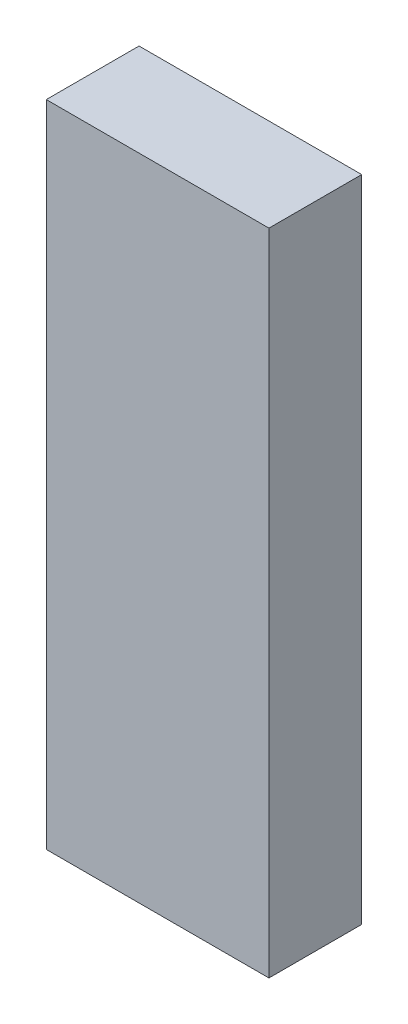
ISO-10303-21;
HEADER;
FILE_DESCRIPTION(('STEP AP214'),'2;1');
FILE_NAME('part.step','',(''),(''),'','','');
FILE_SCHEMA(('AUTOMOTIVE_DESIGN { 1 0 10303 214 1 1 1 1 }'));
ENDSEC;
DATA;
#1=APPLICATION_CONTEXT('core data for automotive mechanical design processes');
#2=APPLICATION_PROTOCOL_DEFINITION('international standard','automotive_design',2000,#1);
#3=PRODUCT_CONTEXT('',#1,'mechanical');
#4=PRODUCT('Part','Part','',(#3));
#5=PRODUCT_RELATED_PRODUCT_CATEGORY('part','',(#4));
#6=PRODUCT_DEFINITION_FORMATION('','',#4);
#7=PRODUCT_DEFINITION_CONTEXT('part definition',#1,'design');
#8=PRODUCT_DEFINITION('design','',#6,#7);
#9=PRODUCT_DEFINITION_SHAPE('','',#8);
#10=(LENGTH_UNIT() NAMED_UNIT(*) SI_UNIT(.MILLI.,.METRE.));
#11=(NAMED_UNIT(*) PLANE_ANGLE_UNIT() SI_UNIT($,.RADIAN.));
#12=(NAMED_UNIT(*) SI_UNIT($,.STERADIAN.) SOLID_ANGLE_UNIT());
#13=UNCERTAINTY_MEASURE_WITH_UNIT(LENGTH_MEASURE(1.E-05),#10,'distance_accuracy_value','');
#14=(GEOMETRIC_REPRESENTATION_CONTEXT(3) GLOBAL_UNCERTAINTY_ASSIGNED_CONTEXT((#13)) GLOBAL_UNIT_ASSIGNED_CONTEXT((#10,
#11,#12)) REPRESENTATION_CONTEXT('',''));
#15=CARTESIAN_POINT('',(0.,0.,0.));
#16=DIRECTION('',(0.,0.,1.));
#17=DIRECTION('',(1.,0.,0.));
#18=AXIS2_PLACEMENT_3D('',#15,#16,#17);
#19=CARTESIAN_POINT('',(-6.,17.5,5.));
#20=DIRECTION('',(1.,0.,0.));
#21=DIRECTION('',(0.,1.,0.));
#22=AXIS2_PLACEMENT_3D('',#19,#20,#21);
#23=PLANE('',#22);
#24=DIRECTION('',(0.,-1.,0.));
#25=VECTOR('',#24,1.);
#26=CARTESIAN_POINT('',(-6.,17.5,0.));
#27=LINE('',#26,#25);
#28=CARTESIAN_POINT('',(-6.,17.5,0.));
#29=VERTEX_POINT('',#28);
#30=CARTESIAN_POINT('',(-6.,-17.5,0.));
#31=VERTEX_POINT('',#30);
#32=EDGE_CURVE('E96',#29,#31,#27,.T.);
#33=ORIENTED_EDGE('',*,*,#32,.T.);
#34=DIRECTION('',(0.,0.,-1.));
#35=VECTOR('',#34,1.);
#36=CARTESIAN_POINT('',(-6.,-17.5,5.));
#37=LINE('',#36,#35);
#38=CARTESIAN_POINT('',(-6.,-17.5,5.));
#39=VERTEX_POINT('',#38);
#40=EDGE_CURVE('E11',#39,#31,#37,.T.);
#41=ORIENTED_EDGE('',*,*,#40,.F.);
#42=DIRECTION('',(0.,-1.,0.));
#43=VECTOR('',#42,1.);
#44=CARTESIAN_POINT('',(-6.,17.5,5.));
#45=LINE('',#44,#43);
#46=CARTESIAN_POINT('',(-6.,17.5,5.));
#47=VERTEX_POINT('',#46);
#48=EDGE_CURVE('E84',#47,#39,#45,.T.);
#49=ORIENTED_EDGE('',*,*,#48,.F.);
#50=DIRECTION('',(0.,0.,-1.));
#51=VECTOR('',#50,1.);
#52=CARTESIAN_POINT('',(-6.,17.5,5.));
#53=LINE('',#52,#51);
#54=EDGE_CURVE('E92',#47,#29,#53,.T.);
#55=ORIENTED_EDGE('',*,*,#54,.T.);
#56=EDGE_LOOP('',(#33,#41,#49,#55));
#57=FACE_BOUND('',#56,.T.);
#58=ADVANCED_FACE('F33',(#57),#23,.F.);
#59=CARTESIAN_POINT('',(-6.,-17.5,5.));
#60=DIRECTION('',(0.,1.,0.));
#61=DIRECTION('',(0.,0.,1.));
#62=AXIS2_PLACEMENT_3D('',#59,#60,#61);
#63=PLANE('',#62);
#64=DIRECTION('',(1.,0.,0.));
#65=VECTOR('',#64,1.);
#66=CARTESIAN_POINT('',(-6.,-17.5,0.));
#67=LINE('',#66,#65);
#68=CARTESIAN_POINT('',(6.,-17.5,0.));
#69=VERTEX_POINT('',#68);
#70=EDGE_CURVE('E88',#31,#69,#67,.T.);
#71=ORIENTED_EDGE('',*,*,#70,.T.);
#72=DIRECTION('',(0.,0.,-1.));
#73=VECTOR('',#72,1.);
#74=CARTESIAN_POINT('',(6.,-17.5,5.));
#75=LINE('',#74,#73);
#76=CARTESIAN_POINT('',(6.,-17.5,5.));
#77=VERTEX_POINT('',#76);
#78=EDGE_CURVE('E41',#77,#69,#75,.T.);
#79=ORIENTED_EDGE('',*,*,#78,.F.);
#80=DIRECTION('',(1.,0.,0.));
#81=VECTOR('',#80,1.);
#82=CARTESIAN_POINT('',(-6.,-17.5,5.));
#83=LINE('',#82,#81);
#84=EDGE_CURVE('E79',#39,#77,#83,.T.);
#85=ORIENTED_EDGE('',*,*,#84,.F.);
#86=ORIENTED_EDGE('',*,*,#40,.T.);
#87=EDGE_LOOP('',(#71,#79,#85,#86));
#88=FACE_BOUND('',#87,.T.);
#89=ADVANCED_FACE('F87',(#88),#63,.F.);
#90=CARTESIAN_POINT('',(6.,17.5,5.));
#91=DIRECTION('',(-1.,0.,0.));
#92=DIRECTION('',(0.,-1.,0.));
#93=AXIS2_PLACEMENT_3D('',#90,#91,#92);
#94=PLANE('',#93);
#95=DIRECTION('',(0.,1.,0.));
#96=VECTOR('',#95,1.);
#97=CARTESIAN_POINT('',(6.,17.5,0.));
#98=LINE('',#97,#96);
#99=CARTESIAN_POINT('',(6.,17.5,0.));
#100=VERTEX_POINT('',#99);
#101=EDGE_CURVE('E66',#69,#100,#98,.T.);
#102=ORIENTED_EDGE('',*,*,#101,.T.);
#103=DIRECTION('',(0.,0.,-1.));
#104=VECTOR('',#103,1.);
#105=CARTESIAN_POINT('',(6.,17.5,5.));
#106=LINE('',#105,#104);
#107=CARTESIAN_POINT('',(6.,17.5,5.));
#108=VERTEX_POINT('',#107);
#109=EDGE_CURVE('E89',#108,#100,#106,.T.);
#110=ORIENTED_EDGE('',*,*,#109,.F.);
#111=DIRECTION('',(0.,1.,0.));
#112=VECTOR('',#111,1.);
#113=CARTESIAN_POINT('',(6.,17.5,5.));
#114=LINE('',#113,#112);
#115=EDGE_CURVE('E82',#77,#108,#114,.T.);
#116=ORIENTED_EDGE('',*,*,#115,.F.);
#117=ORIENTED_EDGE('',*,*,#78,.T.);
#118=EDGE_LOOP('',(#102,#110,#116,#117));
#119=FACE_BOUND('',#118,.T.);
#120=ADVANCED_FACE('F90',(#119),#94,.F.);
#121=CARTESIAN_POINT('',(-6.,17.5,5.));
#122=DIRECTION('',(0.,-1.,0.));
#123=DIRECTION('',(0.,0.,-1.));
#124=AXIS2_PLACEMENT_3D('',#121,#122,#123);
#125=PLANE('',#124);
#126=DIRECTION('',(-1.,0.,0.));
#127=VECTOR('',#126,1.);
#128=CARTESIAN_POINT('',(-6.,17.5,0.));
#129=LINE('',#128,#127);
#130=EDGE_CURVE('E72',#100,#29,#129,.T.);
#131=ORIENTED_EDGE('',*,*,#130,.T.);
#132=ORIENTED_EDGE('',*,*,#54,.F.);
#133=DIRECTION('',(-1.,0.,0.));
#134=VECTOR('',#133,1.);
#135=CARTESIAN_POINT('',(-6.,17.5,5.));
#136=LINE('',#135,#134);
#137=EDGE_CURVE('E49',#108,#47,#136,.T.);
#138=ORIENTED_EDGE('',*,*,#137,.F.);
#139=ORIENTED_EDGE('',*,*,#109,.T.);
#140=EDGE_LOOP('',(#131,#132,#138,#139));
#141=FACE_BOUND('',#140,.T.);
#142=ADVANCED_FACE('F103',(#141),#125,.F.);
#143=CARTESIAN_POINT('',(0.,0.,5.));
#144=DIRECTION('',(0.,0.,1.));
#145=DIRECTION('',(1.,0.,0.));
#146=AXIS2_PLACEMENT_3D('',#143,#144,#145);
#147=PLANE('',#146);
#148=ORIENTED_EDGE('',*,*,#48,.T.);
#149=ORIENTED_EDGE('',*,*,#84,.T.);
#150=ORIENTED_EDGE('',*,*,#115,.T.);
#151=ORIENTED_EDGE('',*,*,#137,.T.);
#152=EDGE_LOOP('',(#148,#149,#150,#151));
#153=FACE_BOUND('',#152,.T.);
#154=ADVANCED_FACE('F80',(#153),#147,.T.);
#155=CARTESIAN_POINT('',(0.,0.,0.));
#156=DIRECTION('',(0.,0.,1.));
#157=DIRECTION('',(1.,0.,0.));
#158=AXIS2_PLACEMENT_3D('',#155,#156,#157);
#159=PLANE('',#158);
#160=ORIENTED_EDGE('',*,*,#32,.F.);
#161=ORIENTED_EDGE('',*,*,#130,.F.);
#162=ORIENTED_EDGE('',*,*,#101,.F.);
#163=ORIENTED_EDGE('',*,*,#70,.F.);
#164=EDGE_LOOP('',(#160,#161,#162,#163));
#165=FACE_BOUND('',#164,.T.);
#166=ADVANCED_FACE('F106',(#165),#159,.F.);
#167=CLOSED_SHELL('',(#58,#89,#120,#142,#154,#166));
#168=MANIFOLD_SOLID_BREP('B2',#167);
#169=ADVANCED_BREP_SHAPE_REPRESENTATION('',(#18,#168),#14);
#170=SHAPE_DEFINITION_REPRESENTATION(#9,#169);
ENDSEC;
END-ISO-10303-21;
